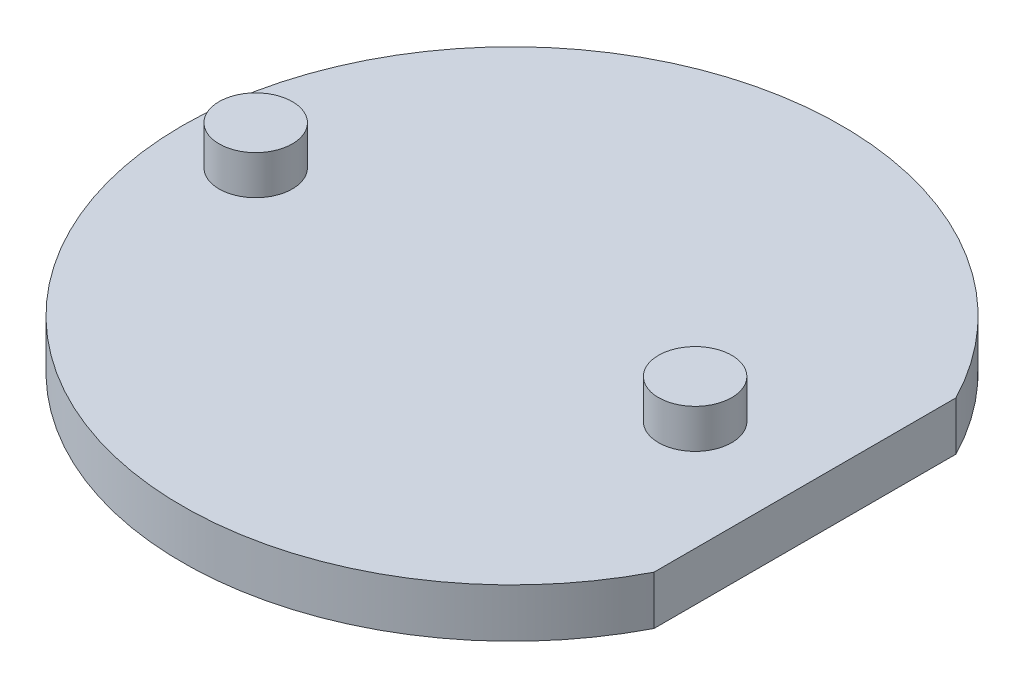
ISO-10303-21;
HEADER;
FILE_DESCRIPTION(('STEP AP214'),'2;1');
FILE_NAME('part.step','',(''),(''),'','','');
FILE_SCHEMA(('AUTOMOTIVE_DESIGN { 1 0 10303 214 1 1 1 1 }'));
ENDSEC;
DATA;
#1=APPLICATION_CONTEXT('core data for automotive mechanical design processes');
#2=APPLICATION_PROTOCOL_DEFINITION('international standard','automotive_design',2000,#1);
#3=PRODUCT_CONTEXT('',#1,'mechanical');
#4=PRODUCT('Part','Part','',(#3));
#5=PRODUCT_RELATED_PRODUCT_CATEGORY('part','',(#4));
#6=PRODUCT_DEFINITION_FORMATION('','',#4);
#7=PRODUCT_DEFINITION_CONTEXT('part definition',#1,'design');
#8=PRODUCT_DEFINITION('design','',#6,#7);
#9=PRODUCT_DEFINITION_SHAPE('','',#8);
#10=(LENGTH_UNIT() NAMED_UNIT(*) SI_UNIT(.MILLI.,.METRE.));
#11=(NAMED_UNIT(*) PLANE_ANGLE_UNIT() SI_UNIT($,.RADIAN.));
#12=(NAMED_UNIT(*) SI_UNIT($,.STERADIAN.) SOLID_ANGLE_UNIT());
#13=UNCERTAINTY_MEASURE_WITH_UNIT(LENGTH_MEASURE(1.E-05),#10,'distance_accuracy_value','');
#14=(GEOMETRIC_REPRESENTATION_CONTEXT(3) GLOBAL_UNCERTAINTY_ASSIGNED_CONTEXT((#13)) GLOBAL_UNIT_ASSIGNED_CONTEXT((#10,
#11,#12)) REPRESENTATION_CONTEXT('',''));
#15=CARTESIAN_POINT('',(0.,0.,0.));
#16=DIRECTION('',(0.,0.,1.));
#17=DIRECTION('',(1.,0.,0.));
#18=AXIS2_PLACEMENT_3D('',#15,#16,#17);
#19=CARTESIAN_POINT('',(0.,2.,0.));
#20=DIRECTION('',(0.,-1.,0.));
#21=DIRECTION('',(0.,0.,-1.));
#22=AXIS2_PLACEMENT_3D('',#19,#20,#21);
#23=CYLINDRICAL_SURFACE('',#22,13.5);
#24=CARTESIAN_POINT('',(0.,0.,0.));
#25=DIRECTION('',(0.,1.,0.));
#26=DIRECTION('',(0.,0.,1.));
#27=AXIS2_PLACEMENT_3D('',#24,#25,#26);
#28=CIRCLE('',#27,13.5);
#29=CARTESIAN_POINT('',(12.,0.,-6.18465843842649));
#30=VERTEX_POINT('',#29);
#31=CARTESIAN_POINT('',(12.,0.,6.18465843842649));
#32=VERTEX_POINT('',#31);
#33=EDGE_CURVE('E75',#30,#32,#28,.T.);
#34=ORIENTED_EDGE('',*,*,#33,.T.);
#35=DIRECTION('',(0.,-1.,0.));
#36=VECTOR('',#35,1.);
#37=CARTESIAN_POINT('',(12.,2.,6.18465843842649));
#38=LINE('',#37,#36);
#39=CARTESIAN_POINT('',(12.,2.,6.18465843842649));
#40=VERTEX_POINT('',#39);
#41=EDGE_CURVE('E44',#40,#32,#38,.T.);
#42=ORIENTED_EDGE('',*,*,#41,.F.);
#43=CARTESIAN_POINT('',(0.,2.,0.));
#44=DIRECTION('',(0.,1.,0.));
#45=DIRECTION('',(0.,0.,1.));
#46=AXIS2_PLACEMENT_3D('',#43,#44,#45);
#47=CIRCLE('',#46,13.5);
#48=CARTESIAN_POINT('',(12.,2.,-6.18465843842649));
#49=VERTEX_POINT('',#48);
#50=EDGE_CURVE('E74',#49,#40,#47,.T.);
#51=ORIENTED_EDGE('',*,*,#50,.F.);
#52=DIRECTION('',(0.,-1.,0.));
#53=VECTOR('',#52,1.);
#54=CARTESIAN_POINT('',(12.,2.,-6.18465843842649));
#55=LINE('',#54,#53);
#56=EDGE_CURVE('E70',#49,#30,#55,.T.);
#57=ORIENTED_EDGE('',*,*,#56,.T.);
#58=EDGE_LOOP('',(#34,#42,#51,#57));
#59=FACE_BOUND('',#58,.T.);
#60=ADVANCED_FACE('F41',(#59),#23,.T.);
#61=CARTESIAN_POINT('',(12.,2.,-6.18465843842649));
#62=DIRECTION('',(-1.,0.,0.));
#63=DIRECTION('',(0.,0.,1.));
#64=AXIS2_PLACEMENT_3D('',#61,#62,#63);
#65=PLANE('',#64);
#66=DIRECTION('',(0.,0.,-1.));
#67=VECTOR('',#66,1.);
#68=CARTESIAN_POINT('',(12.,0.,-6.18465843842649));
#69=LINE('',#68,#67);
#70=EDGE_CURVE('E65',#32,#30,#69,.T.);
#71=ORIENTED_EDGE('',*,*,#70,.T.);
#72=ORIENTED_EDGE('',*,*,#56,.F.);
#73=DIRECTION('',(0.,0.,-1.));
#74=VECTOR('',#73,1.);
#75=CARTESIAN_POINT('',(12.,2.,-6.18465843842649));
#76=LINE('',#75,#74);
#77=EDGE_CURVE('E57',#40,#49,#76,.T.);
#78=ORIENTED_EDGE('',*,*,#77,.F.);
#79=ORIENTED_EDGE('',*,*,#41,.T.);
#80=EDGE_LOOP('',(#71,#72,#78,#79));
#81=FACE_BOUND('',#80,.T.);
#82=ADVANCED_FACE('F69',(#81),#65,.F.);
#83=CARTESIAN_POINT('',(0.,2.,0.));
#84=DIRECTION('',(0.,1.,0.));
#85=DIRECTION('',(0.,0.,1.));
#86=AXIS2_PLACEMENT_3D('',#83,#84,#85);
#87=PLANE('',#86);
#88=CARTESIAN_POINT('',(-10.5,2.,0.));
#89=DIRECTION('',(0.,1.,0.));
#90=DIRECTION('',(0.,0.,1.));
#91=AXIS2_PLACEMENT_3D('',#88,#89,#90);
#92=CIRCLE('',#91,1.5);
#93=CARTESIAN_POINT('',(-10.5,2.,1.5));
#94=VERTEX_POINT('',#93);
#95=EDGE_CURVE('E90',#94,#94,#92,.T.);
#96=ORIENTED_EDGE('',*,*,#95,.F.);
#97=EDGE_LOOP('',(#96));
#98=FACE_BOUND('',#97,.T.);
#99=CARTESIAN_POINT('',(7.5,2.,0.));
#100=DIRECTION('',(0.,1.,0.));
#101=DIRECTION('',(0.,0.,1.));
#102=AXIS2_PLACEMENT_3D('',#99,#100,#101);
#103=CIRCLE('',#102,1.5);
#104=CARTESIAN_POINT('',(7.5,2.,1.5));
#105=VERTEX_POINT('',#104);
#106=EDGE_CURVE('E82',#105,#105,#103,.T.);
#107=ORIENTED_EDGE('',*,*,#106,.F.);
#108=EDGE_LOOP('',(#107));
#109=FACE_BOUND('',#108,.T.);
#110=ORIENTED_EDGE('',*,*,#50,.T.);
#111=ORIENTED_EDGE('',*,*,#77,.T.);
#112=EDGE_LOOP('',(#110,#111));
#113=FACE_BOUND('',#112,.T.);
#114=ADVANCED_FACE('F110',(#98,#109,#113),#87,.T.);
#115=CARTESIAN_POINT('',(0.,0.,0.));
#116=DIRECTION('',(0.,1.,0.));
#117=DIRECTION('',(0.,0.,1.));
#118=AXIS2_PLACEMENT_3D('',#115,#116,#117);
#119=PLANE('',#118);
#120=CARTESIAN_POINT('',(0.,0.,0.));
#121=DIRECTION('',(0.,-1.,0.));
#122=DIRECTION('',(0.,0.,-1.));
#123=AXIS2_PLACEMENT_3D('',#120,#121,#122);
#124=CIRCLE('',#123,2.5);
#125=CARTESIAN_POINT('',(0.,0.,-2.5));
#126=VERTEX_POINT('',#125);
#127=EDGE_CURVE('E11',#126,#126,#124,.T.);
#128=ORIENTED_EDGE('',*,*,#127,.F.);
#129=EDGE_LOOP('',(#128));
#130=FACE_BOUND('',#129,.T.);
#131=ORIENTED_EDGE('',*,*,#33,.F.);
#132=ORIENTED_EDGE('',*,*,#70,.F.);
#133=EDGE_LOOP('',(#131,#132));
#134=FACE_BOUND('',#133,.T.);
#135=ADVANCED_FACE('F78',(#130,#134),#119,.F.);
#136=CARTESIAN_POINT('',(7.5,3.6,0.));
#137=DIRECTION('',(0.,-1.,0.));
#138=DIRECTION('',(0.,0.,-1.));
#139=AXIS2_PLACEMENT_3D('',#136,#137,#138);
#140=CYLINDRICAL_SURFACE('',#139,1.5);
#141=CARTESIAN_POINT('',(7.5,3.6,0.));
#142=DIRECTION('',(0.,1.,0.));
#143=DIRECTION('',(0.,0.,1.));
#144=AXIS2_PLACEMENT_3D('',#141,#142,#143);
#145=CIRCLE('',#144,1.5);
#146=CARTESIAN_POINT('',(7.5,3.6,1.5));
#147=VERTEX_POINT('',#146);
#148=EDGE_CURVE('E79',#147,#147,#145,.T.);
#149=ORIENTED_EDGE('',*,*,#148,.F.);
#150=EDGE_LOOP('',(#149));
#151=FACE_BOUND('',#150,.T.);
#152=ORIENTED_EDGE('',*,*,#106,.T.);
#153=EDGE_LOOP('',(#152));
#154=FACE_BOUND('',#153,.T.);
#155=ADVANCED_FACE('F109',(#151,#154),#140,.T.);
#156=CARTESIAN_POINT('',(7.5,3.6,0.));
#157=DIRECTION('',(0.,1.,0.));
#158=DIRECTION('',(0.,0.,1.));
#159=AXIS2_PLACEMENT_3D('',#156,#157,#158);
#160=PLANE('',#159);
#161=ORIENTED_EDGE('',*,*,#148,.T.);
#162=EDGE_LOOP('',(#161));
#163=FACE_BOUND('',#162,.T.);
#164=ADVANCED_FACE('F116',(#163),#160,.T.);
#165=CARTESIAN_POINT('',(-10.5,3.6,0.));
#166=DIRECTION('',(0.,-1.,0.));
#167=DIRECTION('',(0.,0.,-1.));
#168=AXIS2_PLACEMENT_3D('',#165,#166,#167);
#169=CYLINDRICAL_SURFACE('',#168,1.5);
#170=CARTESIAN_POINT('',(-10.5,3.6,0.));
#171=DIRECTION('',(0.,1.,0.));
#172=DIRECTION('',(0.,0.,1.));
#173=AXIS2_PLACEMENT_3D('',#170,#171,#172);
#174=CIRCLE('',#173,1.5);
#175=CARTESIAN_POINT('',(-10.5,3.6,1.5));
#176=VERTEX_POINT('',#175);
#177=EDGE_CURVE('E88',#176,#176,#174,.T.);
#178=ORIENTED_EDGE('',*,*,#177,.F.);
#179=EDGE_LOOP('',(#178));
#180=FACE_BOUND('',#179,.T.);
#181=ORIENTED_EDGE('',*,*,#95,.T.);
#182=EDGE_LOOP('',(#181));
#183=FACE_BOUND('',#182,.T.);
#184=ADVANCED_FACE('F142',(#180,#183),#169,.T.);
#185=CARTESIAN_POINT('',(-10.5,3.6,0.));
#186=DIRECTION('',(0.,1.,0.));
#187=DIRECTION('',(0.,0.,1.));
#188=AXIS2_PLACEMENT_3D('',#185,#186,#187);
#189=PLANE('',#188);
#190=ORIENTED_EDGE('',*,*,#177,.T.);
#191=EDGE_LOOP('',(#190));
#192=FACE_BOUND('',#191,.T.);
#193=ADVANCED_FACE('F104',(#192),#189,.T.);
#194=CARTESIAN_POINT('',(0.,-2.,0.));
#195=DIRECTION('',(0.,1.,0.));
#196=DIRECTION('',(0.,0.,1.));
#197=AXIS2_PLACEMENT_3D('',#194,#195,#196);
#198=CYLINDRICAL_SURFACE('',#197,2.5);
#199=CARTESIAN_POINT('',(0.,-2.,0.));
#200=DIRECTION('',(0.,-1.,0.));
#201=DIRECTION('',(0.,0.,-1.));
#202=AXIS2_PLACEMENT_3D('',#199,#200,#201);
#203=CIRCLE('',#202,2.5);
#204=CARTESIAN_POINT('',(0.,-2.,-2.5));
#205=VERTEX_POINT('',#204);
#206=EDGE_CURVE('E93',#205,#205,#203,.T.);
#207=ORIENTED_EDGE('',*,*,#206,.F.);
#208=EDGE_LOOP('',(#207));
#209=FACE_BOUND('',#208,.T.);
#210=ORIENTED_EDGE('',*,*,#127,.T.);
#211=EDGE_LOOP('',(#210));
#212=FACE_BOUND('',#211,.T.);
#213=ADVANCED_FACE('F101',(#209,#212),#198,.T.);
#214=CARTESIAN_POINT('',(0.,-2.,0.));
#215=DIRECTION('',(0.,-1.,0.));
#216=DIRECTION('',(0.,0.,-1.));
#217=AXIS2_PLACEMENT_3D('',#214,#215,#216);
#218=PLANE('',#217);
#219=ORIENTED_EDGE('',*,*,#206,.T.);
#220=EDGE_LOOP('',(#219));
#221=FACE_BOUND('',#220,.T.);
#222=ADVANCED_FACE('F99',(#221),#218,.T.);
#223=CLOSED_SHELL('',(#60,#82,#114,#135,#155,#164,#184,#193,#213,#222));
#224=MANIFOLD_SOLID_BREP('B2',#223);
#225=ADVANCED_BREP_SHAPE_REPRESENTATION('',(#18,#224),#14);
#226=SHAPE_DEFINITION_REPRESENTATION(#9,#225);
ENDSEC;
END-ISO-10303-21;
